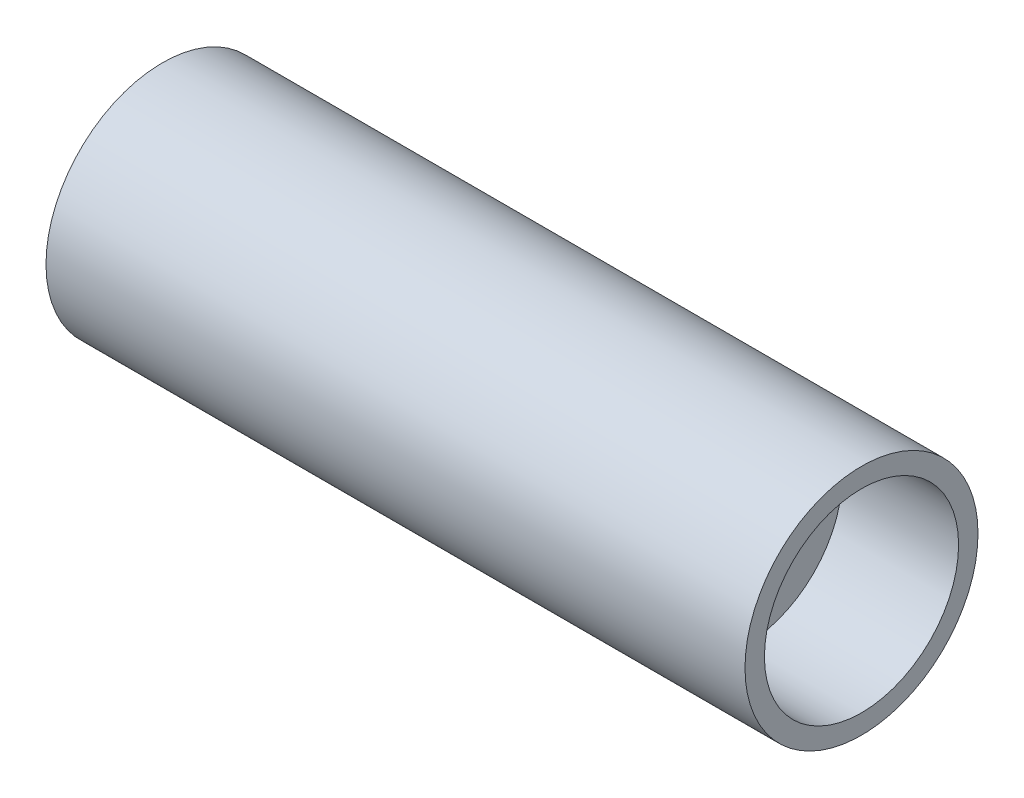
ISO-10303-21;
HEADER;
FILE_DESCRIPTION(('STEP AP214'),'2;1');
FILE_NAME('part.step','',(''),(''),'','','');
FILE_SCHEMA(('AUTOMOTIVE_DESIGN { 1 0 10303 214 1 1 1 1 }'));
ENDSEC;
DATA;
#1=APPLICATION_CONTEXT('core data for automotive mechanical design processes');
#2=APPLICATION_PROTOCOL_DEFINITION('international standard','automotive_design',2000,#1);
#3=PRODUCT_CONTEXT('',#1,'mechanical');
#4=PRODUCT('Part','Part','',(#3));
#5=PRODUCT_RELATED_PRODUCT_CATEGORY('part','',(#4));
#6=PRODUCT_DEFINITION_FORMATION('','',#4);
#7=PRODUCT_DEFINITION_CONTEXT('part definition',#1,'design');
#8=PRODUCT_DEFINITION('design','',#6,#7);
#9=PRODUCT_DEFINITION_SHAPE('','',#8);
#10=(LENGTH_UNIT() NAMED_UNIT(*) SI_UNIT(.MILLI.,.METRE.));
#11=(NAMED_UNIT(*) PLANE_ANGLE_UNIT() SI_UNIT($,.RADIAN.));
#12=(NAMED_UNIT(*) SI_UNIT($,.STERADIAN.) SOLID_ANGLE_UNIT());
#13=UNCERTAINTY_MEASURE_WITH_UNIT(LENGTH_MEASURE(1.E-05),#10,'distance_accuracy_value','');
#14=(GEOMETRIC_REPRESENTATION_CONTEXT(3) GLOBAL_UNCERTAINTY_ASSIGNED_CONTEXT((#13)) GLOBAL_UNIT_ASSIGNED_CONTEXT((#10,
#11,#12)) REPRESENTATION_CONTEXT('',''));
#15=CARTESIAN_POINT('',(0.,0.,0.));
#16=DIRECTION('',(0.,0.,1.));
#17=DIRECTION('',(1.,0.,0.));
#18=AXIS2_PLACEMENT_3D('',#15,#16,#17);
#19=CARTESIAN_POINT('',(8.,0.,0.));
#20=DIRECTION('',(-1.,0.,0.));
#21=DIRECTION('',(0.,0.,1.));
#22=AXIS2_PLACEMENT_3D('',#19,#20,#21);
#23=CYLINDRICAL_SURFACE('',#22,3.);
#24=CARTESIAN_POINT('',(8.,0.,0.));
#25=DIRECTION('',(1.,0.,0.));
#26=DIRECTION('',(0.,0.,-1.));
#27=AXIS2_PLACEMENT_3D('',#24,#25,#26);
#28=CIRCLE('',#27,3.);
#29=CARTESIAN_POINT('',(8.,0.,-3.));
#30=VERTEX_POINT('',#29);
#31=EDGE_CURVE('E10',#30,#30,#28,.T.);
#32=ORIENTED_EDGE('',*,*,#31,.F.);
#33=EDGE_LOOP('',(#32));
#34=FACE_BOUND('',#33,.T.);
#35=CARTESIAN_POINT('',(-10.,0.,0.));
#36=DIRECTION('',(-1.,0.,0.));
#37=DIRECTION('',(0.,0.,1.));
#38=AXIS2_PLACEMENT_3D('',#35,#36,#37);
#39=CIRCLE('',#38,3.);
#40=CARTESIAN_POINT('',(-10.,0.,3.));
#41=VERTEX_POINT('',#40);
#42=EDGE_CURVE('E60',#41,#41,#39,.T.);
#43=ORIENTED_EDGE('',*,*,#42,.F.);
#44=EDGE_LOOP('',(#43));
#45=FACE_BOUND('',#44,.T.);
#46=ADVANCED_FACE('F37',(#34,#45),#23,.T.);
#47=CARTESIAN_POINT('',(8.,0.,0.));
#48=DIRECTION('',(1.,0.,0.));
#49=DIRECTION('',(0.,0.,-1.));
#50=AXIS2_PLACEMENT_3D('',#47,#48,#49);
#51=PLANE('',#50);
#52=CARTESIAN_POINT('',(8.,0.,0.));
#53=DIRECTION('',(1.,0.,0.));
#54=DIRECTION('',(0.,0.,-1.));
#55=AXIS2_PLACEMENT_3D('',#52,#53,#54);
#56=CIRCLE('',#55,2.5);
#57=CARTESIAN_POINT('',(8.,0.,-2.5));
#58=VERTEX_POINT('',#57);
#59=EDGE_CURVE('E49',#58,#58,#56,.T.);
#60=ORIENTED_EDGE('',*,*,#59,.F.);
#61=EDGE_LOOP('',(#60));
#62=FACE_BOUND('',#61,.T.);
#63=ORIENTED_EDGE('',*,*,#31,.T.);
#64=EDGE_LOOP('',(#63));
#65=FACE_BOUND('',#64,.T.);
#66=ADVANCED_FACE('F87',(#62,#65),#51,.T.);
#67=CARTESIAN_POINT('',(5.,0.,0.));
#68=DIRECTION('',(1.,0.,0.));
#69=DIRECTION('',(0.,0.,-1.));
#70=AXIS2_PLACEMENT_3D('',#67,#68,#69);
#71=CYLINDRICAL_SURFACE('',#70,2.5);
#72=CARTESIAN_POINT('',(5.,0.,0.));
#73=DIRECTION('',(1.,0.,0.));
#74=DIRECTION('',(0.,0.,-1.));
#75=AXIS2_PLACEMENT_3D('',#72,#73,#74);
#76=CIRCLE('',#75,2.5);
#77=CARTESIAN_POINT('',(5.,0.,-2.5));
#78=VERTEX_POINT('',#77);
#79=EDGE_CURVE('E44',#78,#78,#76,.T.);
#80=ORIENTED_EDGE('',*,*,#79,.F.);
#81=EDGE_LOOP('',(#80));
#82=FACE_BOUND('',#81,.T.);
#83=ORIENTED_EDGE('',*,*,#59,.T.);
#84=EDGE_LOOP('',(#83));
#85=FACE_BOUND('',#84,.T.);
#86=ADVANCED_FACE('F84',(#82,#85),#71,.F.);
#87=CARTESIAN_POINT('',(5.,0.,0.));
#88=DIRECTION('',(1.,0.,0.));
#89=DIRECTION('',(0.,0.,-1.));
#90=AXIS2_PLACEMENT_3D('',#87,#88,#89);
#91=PLANE('',#90);
#92=ORIENTED_EDGE('',*,*,#79,.T.);
#93=EDGE_LOOP('',(#92));
#94=FACE_BOUND('',#93,.T.);
#95=ADVANCED_FACE('F73',(#94),#91,.T.);
#96=CARTESIAN_POINT('',(-10.,0.,0.));
#97=DIRECTION('',(-1.,0.,0.));
#98=DIRECTION('',(0.,0.,1.));
#99=AXIS2_PLACEMENT_3D('',#96,#97,#98);
#100=PLANE('',#99);
#101=ORIENTED_EDGE('',*,*,#42,.T.);
#102=EDGE_LOOP('',(#101));
#103=FACE_BOUND('',#102,.T.);
#104=CARTESIAN_POINT('',(-10.,0.,0.));
#105=DIRECTION('',(-1.,0.,0.));
#106=DIRECTION('',(0.,0.,1.));
#107=AXIS2_PLACEMENT_3D('',#104,#105,#106);
#108=CIRCLE('',#107,2.5);
#109=CARTESIAN_POINT('',(-10.,0.,2.5));
#110=VERTEX_POINT('',#109);
#111=EDGE_CURVE('E64',#110,#110,#108,.T.);
#112=ORIENTED_EDGE('',*,*,#111,.F.);
#113=EDGE_LOOP('',(#112));
#114=FACE_BOUND('',#113,.T.);
#115=ADVANCED_FACE('F71',(#103,#114),#100,.T.);
#116=CARTESIAN_POINT('',(-10.,0.,0.));
#117=DIRECTION('',(1.,0.,0.));
#118=DIRECTION('',(0.,0.,-1.));
#119=AXIS2_PLACEMENT_3D('',#116,#117,#118);
#120=CYLINDRICAL_SURFACE('',#119,2.5);
#121=CARTESIAN_POINT('',(-8.,0.,0.));
#122=DIRECTION('',(-1.,0.,0.));
#123=DIRECTION('',(0.,0.,1.));
#124=AXIS2_PLACEMENT_3D('',#121,#122,#123);
#125=CIRCLE('',#124,2.5);
#126=CARTESIAN_POINT('',(-8.,0.,2.5));
#127=VERTEX_POINT('',#126);
#128=EDGE_CURVE('E55',#127,#127,#125,.F.);
#129=ORIENTED_EDGE('',*,*,#128,.T.);
#130=EDGE_LOOP('',(#129));
#131=FACE_BOUND('',#130,.T.);
#132=ORIENTED_EDGE('',*,*,#111,.T.);
#133=EDGE_LOOP('',(#132));
#134=FACE_BOUND('',#133,.T.);
#135=ADVANCED_FACE('F69',(#131,#134),#120,.F.);
#136=CARTESIAN_POINT('',(-8.,0.,0.));
#137=DIRECTION('',(-1.,0.,0.));
#138=DIRECTION('',(0.,0.,1.));
#139=AXIS2_PLACEMENT_3D('',#136,#137,#138);
#140=PLANE('',#139);
#141=ORIENTED_EDGE('',*,*,#128,.F.);
#142=EDGE_LOOP('',(#141));
#143=FACE_BOUND('',#142,.T.);
#144=ADVANCED_FACE('F80',(#143),#140,.T.);
#145=CLOSED_SHELL('',(#46,#66,#86,#95,#115,#135,#144));
#146=MANIFOLD_SOLID_BREP('B2',#145);
#147=ADVANCED_BREP_SHAPE_REPRESENTATION('',(#18,#146),#14);
#148=SHAPE_DEFINITION_REPRESENTATION(#9,#147);
ENDSEC;
END-ISO-10303-21;
